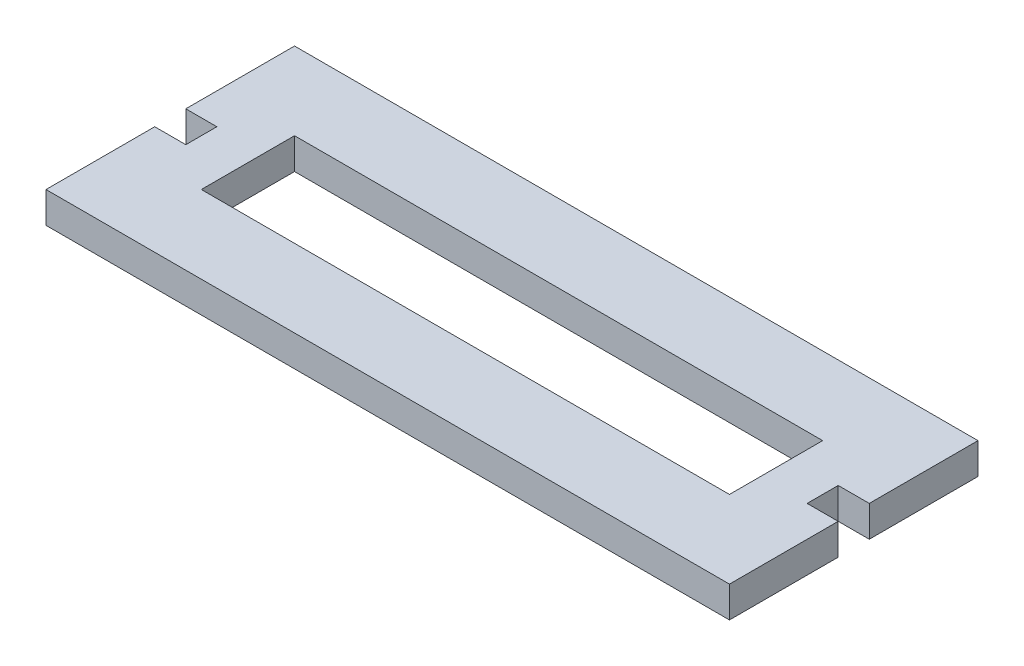
ISO-10303-21;
HEADER;
FILE_DESCRIPTION(('STEP AP214'),'2;1');
FILE_NAME('part.step','',(''),(''),'','','');
FILE_SCHEMA(('AUTOMOTIVE_DESIGN { 1 0 10303 214 1 1 1 1 }'));
ENDSEC;
DATA;
#1=APPLICATION_CONTEXT('core data for automotive mechanical design processes');
#2=APPLICATION_PROTOCOL_DEFINITION('international standard','automotive_design',2000,#1);
#3=PRODUCT_CONTEXT('',#1,'mechanical');
#4=PRODUCT('Part','Part','',(#3));
#5=PRODUCT_RELATED_PRODUCT_CATEGORY('part','',(#4));
#6=PRODUCT_DEFINITION_FORMATION('','',#4);
#7=PRODUCT_DEFINITION_CONTEXT('part definition',#1,'design');
#8=PRODUCT_DEFINITION('design','',#6,#7);
#9=PRODUCT_DEFINITION_SHAPE('','',#8);
#10=(LENGTH_UNIT() NAMED_UNIT(*) SI_UNIT(.MILLI.,.METRE.));
#11=(NAMED_UNIT(*) PLANE_ANGLE_UNIT() SI_UNIT($,.RADIAN.));
#12=(NAMED_UNIT(*) SI_UNIT($,.STERADIAN.) SOLID_ANGLE_UNIT());
#13=UNCERTAINTY_MEASURE_WITH_UNIT(LENGTH_MEASURE(1.E-05),#10,'distance_accuracy_value','');
#14=(GEOMETRIC_REPRESENTATION_CONTEXT(3) GLOBAL_UNCERTAINTY_ASSIGNED_CONTEXT((#13)) GLOBAL_UNIT_ASSIGNED_CONTEXT((#10,
#11,#12)) REPRESENTATION_CONTEXT('',''));
#15=CARTESIAN_POINT('',(0.,0.,0.));
#16=DIRECTION('',(0.,0.,1.));
#17=DIRECTION('',(1.,0.,0.));
#18=AXIS2_PLACEMENT_3D('',#15,#16,#17);
#19=CARTESIAN_POINT('',(0.,3.175,0.));
#20=DIRECTION('',(0.,0.,-1.));
#21=DIRECTION('',(-1.,0.,0.));
#22=AXIS2_PLACEMENT_3D('',#19,#20,#21);
#23=PLANE('',#22);
#24=DIRECTION('',(1.,0.,0.));
#25=VECTOR('',#24,1.);
#26=CARTESIAN_POINT('',(0.,0.,0.));
#27=LINE('',#26,#25);
#28=CARTESIAN_POINT('',(-3.175,0.,0.));
#29=VERTEX_POINT('',#28);
#30=CARTESIAN_POINT('',(66.675,0.,0.));
#31=VERTEX_POINT('',#30);
#32=EDGE_CURVE('E182',#29,#31,#27,.T.);
#33=ORIENTED_EDGE('',*,*,#32,.T.);
#34=DIRECTION('',(0.,-1.,0.));
#35=VECTOR('',#34,1.);
#36=CARTESIAN_POINT('',(66.675,3.175,0.));
#37=LINE('',#36,#35);
#38=CARTESIAN_POINT('',(66.675,3.175,0.));
#39=VERTEX_POINT('',#38);
#40=EDGE_CURVE('E11',#39,#31,#37,.T.);
#41=ORIENTED_EDGE('',*,*,#40,.F.);
#42=DIRECTION('',(1.,0.,0.));
#43=VECTOR('',#42,1.);
#44=CARTESIAN_POINT('',(0.,3.175,0.));
#45=LINE('',#44,#43);
#46=CARTESIAN_POINT('',(-3.175,3.175,0.));
#47=VERTEX_POINT('',#46);
#48=EDGE_CURVE('E186',#47,#39,#45,.T.);
#49=ORIENTED_EDGE('',*,*,#48,.F.);
#50=DIRECTION('',(0.,-1.,0.));
#51=VECTOR('',#50,1.);
#52=CARTESIAN_POINT('',(-3.175,3.175,0.));
#53=LINE('',#52,#51);
#54=EDGE_CURVE('E218',#47,#29,#53,.T.);
#55=ORIENTED_EDGE('',*,*,#54,.T.);
#56=EDGE_LOOP('',(#33,#41,#49,#55));
#57=FACE_BOUND('',#56,.T.);
#58=ADVANCED_FACE('F37',(#57),#23,.F.);
#59=CARTESIAN_POINT('',(66.675,3.175,0.));
#60=DIRECTION('',(-1.,0.,0.));
#61=DIRECTION('',(0.,0.,1.));
#62=AXIS2_PLACEMENT_3D('',#59,#60,#61);
#63=PLANE('',#62);
#64=DIRECTION('',(0.,0.,-1.));
#65=VECTOR('',#64,1.);
#66=CARTESIAN_POINT('',(66.675,0.,0.));
#67=LINE('',#66,#65);
#68=CARTESIAN_POINT('',(66.675,0.,-11.1125));
#69=VERTEX_POINT('',#68);
#70=EDGE_CURVE('E221',#31,#69,#67,.T.);
#71=ORIENTED_EDGE('',*,*,#70,.T.);
#72=DIRECTION('',(0.,-1.,0.));
#73=VECTOR('',#72,1.);
#74=CARTESIAN_POINT('',(66.675,3.175,-11.1125));
#75=LINE('',#74,#73);
#76=CARTESIAN_POINT('',(66.675,3.175,-11.1125));
#77=VERTEX_POINT('',#76);
#78=EDGE_CURVE('E44',#77,#69,#75,.T.);
#79=ORIENTED_EDGE('',*,*,#78,.F.);
#80=DIRECTION('',(0.,0.,-1.));
#81=VECTOR('',#80,1.);
#82=CARTESIAN_POINT('',(66.675,3.175,0.));
#83=LINE('',#82,#81);
#84=EDGE_CURVE('E189',#39,#77,#83,.T.);
#85=ORIENTED_EDGE('',*,*,#84,.F.);
#86=ORIENTED_EDGE('',*,*,#40,.T.);
#87=EDGE_LOOP('',(#71,#79,#85,#86));
#88=FACE_BOUND('',#87,.T.);
#89=ADVANCED_FACE('F277',(#88),#63,.F.);
#90=CARTESIAN_POINT('',(0.,3.175,-11.1125));
#91=DIRECTION('',(0.,0.,-1.));
#92=DIRECTION('',(-1.,0.,0.));
#93=AXIS2_PLACEMENT_3D('',#90,#91,#92);
#94=PLANE('',#93);
#95=DIRECTION('',(1.,0.,0.));
#96=VECTOR('',#95,1.);
#97=CARTESIAN_POINT('',(0.,0.,-11.1125));
#98=LINE('',#97,#96);
#99=CARTESIAN_POINT('',(63.5,0.,-11.1125));
#100=VERTEX_POINT('',#99);
#101=EDGE_CURVE('E224',#100,#69,#98,.T.);
#102=ORIENTED_EDGE('',*,*,#101,.F.);
#103=DIRECTION('',(0.,-1.,0.));
#104=VECTOR('',#103,1.);
#105=CARTESIAN_POINT('',(63.5,3.175,-11.1125));
#106=LINE('',#105,#104);
#107=CARTESIAN_POINT('',(63.5,3.175,-11.1125));
#108=VERTEX_POINT('',#107);
#109=EDGE_CURVE('E270',#108,#100,#106,.T.);
#110=ORIENTED_EDGE('',*,*,#109,.F.);
#111=DIRECTION('',(1.,0.,0.));
#112=VECTOR('',#111,1.);
#113=CARTESIAN_POINT('',(0.,3.175,-11.1125));
#114=LINE('',#113,#112);
#115=EDGE_CURVE('E192',#108,#77,#114,.T.);
#116=ORIENTED_EDGE('',*,*,#115,.T.);
#117=ORIENTED_EDGE('',*,*,#78,.T.);
#118=EDGE_LOOP('',(#102,#110,#116,#117));
#119=FACE_BOUND('',#118,.T.);
#120=ADVANCED_FACE('F274',(#119),#94,.T.);
#121=CARTESIAN_POINT('',(63.5,3.175,0.));
#122=DIRECTION('',(-1.,0.,0.));
#123=DIRECTION('',(0.,0.,1.));
#124=AXIS2_PLACEMENT_3D('',#121,#122,#123);
#125=PLANE('',#124);
#126=DIRECTION('',(0.,0.,-1.));
#127=VECTOR('',#126,1.);
#128=CARTESIAN_POINT('',(63.5,0.,0.));
#129=LINE('',#128,#127);
#130=CARTESIAN_POINT('',(63.5,0.,-14.2875));
#131=VERTEX_POINT('',#130);
#132=EDGE_CURVE('E227',#100,#131,#129,.T.);
#133=ORIENTED_EDGE('',*,*,#132,.T.);
#134=DIRECTION('',(0.,-1.,0.));
#135=VECTOR('',#134,1.);
#136=CARTESIAN_POINT('',(63.5,3.175,-14.2875));
#137=LINE('',#136,#135);
#138=CARTESIAN_POINT('',(63.5,3.175,-14.2875));
#139=VERTEX_POINT('',#138);
#140=EDGE_CURVE('E267',#139,#131,#137,.T.);
#141=ORIENTED_EDGE('',*,*,#140,.F.);
#142=DIRECTION('',(0.,0.,-1.));
#143=VECTOR('',#142,1.);
#144=CARTESIAN_POINT('',(63.5,3.175,0.));
#145=LINE('',#144,#143);
#146=EDGE_CURVE('E195',#108,#139,#145,.T.);
#147=ORIENTED_EDGE('',*,*,#146,.F.);
#148=ORIENTED_EDGE('',*,*,#109,.T.);
#149=EDGE_LOOP('',(#133,#141,#147,#148));
#150=FACE_BOUND('',#149,.T.);
#151=ADVANCED_FACE('F285',(#150),#125,.F.);
#152=CARTESIAN_POINT('',(0.,3.175,-14.2875));
#153=DIRECTION('',(0.,0.,-1.));
#154=DIRECTION('',(-1.,0.,0.));
#155=AXIS2_PLACEMENT_3D('',#152,#153,#154);
#156=PLANE('',#155);
#157=DIRECTION('',(1.,0.,0.));
#158=VECTOR('',#157,1.);
#159=CARTESIAN_POINT('',(0.,0.,-14.2875));
#160=LINE('',#159,#158);
#161=CARTESIAN_POINT('',(66.675,0.,-14.2875));
#162=VERTEX_POINT('',#161);
#163=EDGE_CURVE('E229',#131,#162,#160,.T.);
#164=ORIENTED_EDGE('',*,*,#163,.T.);
#165=DIRECTION('',(0.,-1.,0.));
#166=VECTOR('',#165,1.);
#167=CARTESIAN_POINT('',(66.675,3.175,-14.2875));
#168=LINE('',#167,#166);
#169=CARTESIAN_POINT('',(66.675,3.175,-14.2875));
#170=VERTEX_POINT('',#169);
#171=EDGE_CURVE('E264',#170,#162,#168,.T.);
#172=ORIENTED_EDGE('',*,*,#171,.F.);
#173=DIRECTION('',(1.,0.,0.));
#174=VECTOR('',#173,1.);
#175=CARTESIAN_POINT('',(0.,3.175,-14.2875));
#176=LINE('',#175,#174);
#177=EDGE_CURVE('E197',#139,#170,#176,.T.);
#178=ORIENTED_EDGE('',*,*,#177,.F.);
#179=ORIENTED_EDGE('',*,*,#140,.T.);
#180=EDGE_LOOP('',(#164,#172,#178,#179));
#181=FACE_BOUND('',#180,.T.);
#182=ADVANCED_FACE('F289',(#181),#156,.F.);
#183=CARTESIAN_POINT('',(66.675,3.175,0.));
#184=DIRECTION('',(-1.,0.,0.));
#185=DIRECTION('',(0.,0.,1.));
#186=AXIS2_PLACEMENT_3D('',#183,#184,#185);
#187=PLANE('',#186);
#188=DIRECTION('',(0.,0.,-1.));
#189=VECTOR('',#188,1.);
#190=CARTESIAN_POINT('',(66.675,0.,0.));
#191=LINE('',#190,#189);
#192=CARTESIAN_POINT('',(66.675,0.,-25.4));
#193=VERTEX_POINT('',#192);
#194=EDGE_CURVE('E231',#162,#193,#191,.T.);
#195=ORIENTED_EDGE('',*,*,#194,.T.);
#196=DIRECTION('',(0.,-1.,0.));
#197=VECTOR('',#196,1.);
#198=CARTESIAN_POINT('',(66.675,3.175,-25.4));
#199=LINE('',#198,#197);
#200=CARTESIAN_POINT('',(66.675,3.175,-25.4));
#201=VERTEX_POINT('',#200);
#202=EDGE_CURVE('E262',#201,#193,#199,.T.);
#203=ORIENTED_EDGE('',*,*,#202,.F.);
#204=DIRECTION('',(0.,0.,-1.));
#205=VECTOR('',#204,1.);
#206=CARTESIAN_POINT('',(66.675,3.175,0.));
#207=LINE('',#206,#205);
#208=EDGE_CURVE('E199',#170,#201,#207,.T.);
#209=ORIENTED_EDGE('',*,*,#208,.F.);
#210=ORIENTED_EDGE('',*,*,#171,.T.);
#211=EDGE_LOOP('',(#195,#203,#209,#210));
#212=FACE_BOUND('',#211,.T.);
#213=ADVANCED_FACE('F323',(#212),#187,.F.);
#214=CARTESIAN_POINT('',(0.,3.175,-25.4));
#215=DIRECTION('',(0.,0.,-1.));
#216=DIRECTION('',(-1.,0.,0.));
#217=AXIS2_PLACEMENT_3D('',#214,#215,#216);
#218=PLANE('',#217);
#219=DIRECTION('',(1.,0.,0.));
#220=VECTOR('',#219,1.);
#221=CARTESIAN_POINT('',(0.,0.,-25.4));
#222=LINE('',#221,#220);
#223=CARTESIAN_POINT('',(-3.175,0.,-25.4));
#224=VERTEX_POINT('',#223);
#225=EDGE_CURVE('E234',#224,#193,#222,.T.);
#226=ORIENTED_EDGE('',*,*,#225,.F.);
#227=DIRECTION('',(0.,-1.,0.));
#228=VECTOR('',#227,1.);
#229=CARTESIAN_POINT('',(-3.175,3.175,-25.4));
#230=LINE('',#229,#228);
#231=CARTESIAN_POINT('',(-3.175,3.175,-25.4));
#232=VERTEX_POINT('',#231);
#233=EDGE_CURVE('E260',#232,#224,#230,.T.);
#234=ORIENTED_EDGE('',*,*,#233,.F.);
#235=DIRECTION('',(1.,0.,0.));
#236=VECTOR('',#235,1.);
#237=CARTESIAN_POINT('',(0.,3.175,-25.4));
#238=LINE('',#237,#236);
#239=EDGE_CURVE('E201',#232,#201,#238,.T.);
#240=ORIENTED_EDGE('',*,*,#239,.T.);
#241=ORIENTED_EDGE('',*,*,#202,.T.);
#242=EDGE_LOOP('',(#226,#234,#240,#241));
#243=FACE_BOUND('',#242,.T.);
#244=ADVANCED_FACE('F321',(#243),#218,.T.);
#245=CARTESIAN_POINT('',(-3.175,3.175,0.));
#246=DIRECTION('',(-1.,0.,0.));
#247=DIRECTION('',(0.,0.,1.));
#248=AXIS2_PLACEMENT_3D('',#245,#246,#247);
#249=PLANE('',#248);
#250=DIRECTION('',(0.,0.,-1.));
#251=VECTOR('',#250,1.);
#252=CARTESIAN_POINT('',(-3.175,0.,0.));
#253=LINE('',#252,#251);
#254=CARTESIAN_POINT('',(-3.175,0.,-14.2875));
#255=VERTEX_POINT('',#254);
#256=EDGE_CURVE('E237',#255,#224,#253,.T.);
#257=ORIENTED_EDGE('',*,*,#256,.F.);
#258=DIRECTION('',(0.,-1.,0.));
#259=VECTOR('',#258,1.);
#260=CARTESIAN_POINT('',(-3.175,3.175,-14.2875));
#261=LINE('',#260,#259);
#262=CARTESIAN_POINT('',(-3.175,3.175,-14.2875));
#263=VERTEX_POINT('',#262);
#264=EDGE_CURVE('E258',#263,#255,#261,.T.);
#265=ORIENTED_EDGE('',*,*,#264,.F.);
#266=DIRECTION('',(0.,0.,-1.));
#267=VECTOR('',#266,1.);
#268=CARTESIAN_POINT('',(-3.175,3.175,0.));
#269=LINE('',#268,#267);
#270=EDGE_CURVE('E204',#263,#232,#269,.T.);
#271=ORIENTED_EDGE('',*,*,#270,.T.);
#272=ORIENTED_EDGE('',*,*,#233,.T.);
#273=EDGE_LOOP('',(#257,#265,#271,#272));
#274=FACE_BOUND('',#273,.T.);
#275=ADVANCED_FACE('F318',(#274),#249,.T.);
#276=CARTESIAN_POINT('',(0.,3.175,-14.2875));
#277=DIRECTION('',(0.,0.,-1.));
#278=DIRECTION('',(-1.,0.,0.));
#279=AXIS2_PLACEMENT_3D('',#276,#277,#278);
#280=PLANE('',#279);
#281=DIRECTION('',(1.,0.,0.));
#282=VECTOR('',#281,1.);
#283=CARTESIAN_POINT('',(0.,0.,-14.2875));
#284=LINE('',#283,#282);
#285=CARTESIAN_POINT('',(0.,0.,-14.2875));
#286=VERTEX_POINT('',#285);
#287=EDGE_CURVE('E240',#255,#286,#284,.T.);
#288=ORIENTED_EDGE('',*,*,#287,.T.);
#289=DIRECTION('',(0.,-1.,0.));
#290=VECTOR('',#289,1.);
#291=CARTESIAN_POINT('',(0.,3.175,-14.2875));
#292=LINE('',#291,#290);
#293=CARTESIAN_POINT('',(0.,3.175,-14.2875));
#294=VERTEX_POINT('',#293);
#295=EDGE_CURVE('E256',#294,#286,#292,.T.);
#296=ORIENTED_EDGE('',*,*,#295,.F.);
#297=DIRECTION('',(1.,0.,0.));
#298=VECTOR('',#297,1.);
#299=CARTESIAN_POINT('',(0.,3.175,-14.2875));
#300=LINE('',#299,#298);
#301=EDGE_CURVE('E207',#263,#294,#300,.T.);
#302=ORIENTED_EDGE('',*,*,#301,.F.);
#303=ORIENTED_EDGE('',*,*,#264,.T.);
#304=EDGE_LOOP('',(#288,#296,#302,#303));
#305=FACE_BOUND('',#304,.T.);
#306=ADVANCED_FACE('F315',(#305),#280,.F.);
#307=CARTESIAN_POINT('',(0.,3.175,0.));
#308=DIRECTION('',(-1.,0.,0.));
#309=DIRECTION('',(0.,0.,1.));
#310=AXIS2_PLACEMENT_3D('',#307,#308,#309);
#311=PLANE('',#310);
#312=DIRECTION('',(0.,0.,-1.));
#313=VECTOR('',#312,1.);
#314=CARTESIAN_POINT('',(0.,0.,0.));
#315=LINE('',#314,#313);
#316=CARTESIAN_POINT('',(0.,0.,-11.1125));
#317=VERTEX_POINT('',#316);
#318=EDGE_CURVE('E243',#317,#286,#315,.T.);
#319=ORIENTED_EDGE('',*,*,#318,.F.);
#320=DIRECTION('',(0.,-1.,0.));
#321=VECTOR('',#320,1.);
#322=CARTESIAN_POINT('',(0.,3.175,-11.1125));
#323=LINE('',#322,#321);
#324=CARTESIAN_POINT('',(0.,3.175,-11.1125));
#325=VERTEX_POINT('',#324);
#326=EDGE_CURVE('E254',#325,#317,#323,.T.);
#327=ORIENTED_EDGE('',*,*,#326,.F.);
#328=DIRECTION('',(0.,0.,-1.));
#329=VECTOR('',#328,1.);
#330=CARTESIAN_POINT('',(0.,3.175,0.));
#331=LINE('',#330,#329);
#332=EDGE_CURVE('E209',#325,#294,#331,.T.);
#333=ORIENTED_EDGE('',*,*,#332,.T.);
#334=ORIENTED_EDGE('',*,*,#295,.T.);
#335=EDGE_LOOP('',(#319,#327,#333,#334));
#336=FACE_BOUND('',#335,.T.);
#337=ADVANCED_FACE('F310',(#336),#311,.T.);
#338=CARTESIAN_POINT('',(0.,3.175,-11.1125));
#339=DIRECTION('',(0.,0.,-1.));
#340=DIRECTION('',(-1.,0.,0.));
#341=AXIS2_PLACEMENT_3D('',#338,#339,#340);
#342=PLANE('',#341);
#343=DIRECTION('',(1.,0.,0.));
#344=VECTOR('',#343,1.);
#345=CARTESIAN_POINT('',(0.,0.,-11.1125));
#346=LINE('',#345,#344);
#347=CARTESIAN_POINT('',(-3.175,0.,-11.1125));
#348=VERTEX_POINT('',#347);
#349=EDGE_CURVE('E246',#348,#317,#346,.T.);
#350=ORIENTED_EDGE('',*,*,#349,.F.);
#351=DIRECTION('',(0.,-1.,0.));
#352=VECTOR('',#351,1.);
#353=CARTESIAN_POINT('',(-3.175,3.175,-11.1125));
#354=LINE('',#353,#352);
#355=CARTESIAN_POINT('',(-3.175,3.175,-11.1125));
#356=VERTEX_POINT('',#355);
#357=EDGE_CURVE('E252',#356,#348,#354,.T.);
#358=ORIENTED_EDGE('',*,*,#357,.F.);
#359=DIRECTION('',(1.,0.,0.));
#360=VECTOR('',#359,1.);
#361=CARTESIAN_POINT('',(0.,3.175,-11.1125));
#362=LINE('',#361,#360);
#363=EDGE_CURVE('E212',#356,#325,#362,.T.);
#364=ORIENTED_EDGE('',*,*,#363,.T.);
#365=ORIENTED_EDGE('',*,*,#326,.T.);
#366=EDGE_LOOP('',(#350,#358,#364,#365));
#367=FACE_BOUND('',#366,.T.);
#368=ADVANCED_FACE('F305',(#367),#342,.T.);
#369=CARTESIAN_POINT('',(-3.175,3.175,0.));
#370=DIRECTION('',(-1.,0.,0.));
#371=DIRECTION('',(0.,0.,1.));
#372=AXIS2_PLACEMENT_3D('',#369,#370,#371);
#373=PLANE('',#372);
#374=DIRECTION('',(0.,0.,-1.));
#375=VECTOR('',#374,1.);
#376=CARTESIAN_POINT('',(-3.175,0.,0.));
#377=LINE('',#376,#375);
#378=EDGE_CURVE('E190',#29,#348,#377,.T.);
#379=ORIENTED_EDGE('',*,*,#378,.F.);
#380=ORIENTED_EDGE('',*,*,#54,.F.);
#381=DIRECTION('',(0.,0.,-1.));
#382=VECTOR('',#381,1.);
#383=CARTESIAN_POINT('',(-3.175,3.175,0.));
#384=LINE('',#383,#382);
#385=EDGE_CURVE('E215',#47,#356,#384,.T.);
#386=ORIENTED_EDGE('',*,*,#385,.T.);
#387=ORIENTED_EDGE('',*,*,#357,.T.);
#388=EDGE_LOOP('',(#379,#380,#386,#387));
#389=FACE_BOUND('',#388,.T.);
#390=ADVANCED_FACE('F302',(#389),#373,.T.);
#391=CARTESIAN_POINT('',(0.,3.175,0.));
#392=DIRECTION('',(0.,1.,0.));
#393=DIRECTION('',(0.,0.,1.));
#394=AXIS2_PLACEMENT_3D('',#391,#392,#393);
#395=PLANE('',#394);
#396=DIRECTION('',(0.,0.,1.));
#397=VECTOR('',#396,1.);
#398=CARTESIAN_POINT('',(4.7625,3.175,-7.9375));
#399=LINE('',#398,#397);
#400=CARTESIAN_POINT('',(4.7625,3.175,-17.4625));
#401=VERTEX_POINT('',#400);
#402=CARTESIAN_POINT('',(4.7625,3.175,-7.9375));
#403=VERTEX_POINT('',#402);
#404=EDGE_CURVE('E51',#401,#403,#399,.T.);
#405=ORIENTED_EDGE('',*,*,#404,.F.);
#406=DIRECTION('',(-1.,0.,0.));
#407=VECTOR('',#406,1.);
#408=CARTESIAN_POINT('',(4.7625,3.175,-17.4625));
#409=LINE('',#408,#407);
#410=CARTESIAN_POINT('',(58.7375,3.175,-17.4625));
#411=VERTEX_POINT('',#410);
#412=EDGE_CURVE('E167',#411,#401,#409,.T.);
#413=ORIENTED_EDGE('',*,*,#412,.F.);
#414=DIRECTION('',(0.,0.,-1.));
#415=VECTOR('',#414,1.);
#416=CARTESIAN_POINT('',(58.7375,3.175,-7.9375));
#417=LINE('',#416,#415);
#418=CARTESIAN_POINT('',(58.7375,3.175,-7.9375));
#419=VERTEX_POINT('',#418);
#420=EDGE_CURVE('E170',#419,#411,#417,.T.);
#421=ORIENTED_EDGE('',*,*,#420,.F.);
#422=DIRECTION('',(1.,0.,0.));
#423=VECTOR('',#422,1.);
#424=CARTESIAN_POINT('',(4.7625,3.175,-7.9375));
#425=LINE('',#424,#423);
#426=EDGE_CURVE('E176',#403,#419,#425,.T.);
#427=ORIENTED_EDGE('',*,*,#426,.F.);
#428=EDGE_LOOP('',(#405,#413,#421,#427));
#429=FACE_BOUND('',#428,.T.);
#430=ORIENTED_EDGE('',*,*,#48,.T.);
#431=ORIENTED_EDGE('',*,*,#84,.T.);
#432=ORIENTED_EDGE('',*,*,#115,.F.);
#433=ORIENTED_EDGE('',*,*,#146,.T.);
#434=ORIENTED_EDGE('',*,*,#177,.T.);
#435=ORIENTED_EDGE('',*,*,#208,.T.);
#436=ORIENTED_EDGE('',*,*,#239,.F.);
#437=ORIENTED_EDGE('',*,*,#270,.F.);
#438=ORIENTED_EDGE('',*,*,#301,.T.);
#439=ORIENTED_EDGE('',*,*,#332,.F.);
#440=ORIENTED_EDGE('',*,*,#363,.F.);
#441=ORIENTED_EDGE('',*,*,#385,.F.);
#442=EDGE_LOOP('',(#430,#431,#432,#433,#434,#435,#436,#437,#438,#439,#440,#441));
#443=FACE_BOUND('',#442,.T.);
#444=ADVANCED_FACE('F293',(#429,#443),#395,.T.);
#445=CARTESIAN_POINT('',(0.,0.,0.));
#446=DIRECTION('',(0.,1.,0.));
#447=DIRECTION('',(0.,0.,1.));
#448=AXIS2_PLACEMENT_3D('',#445,#446,#447);
#449=PLANE('',#448);
#450=DIRECTION('',(-1.,0.,0.));
#451=VECTOR('',#450,1.);
#452=CARTESIAN_POINT('',(4.7625,0.,-17.4625));
#453=LINE('',#452,#451);
#454=CARTESIAN_POINT('',(58.7375,0.,-17.4625));
#455=VERTEX_POINT('',#454);
#456=CARTESIAN_POINT('',(4.7625,0.,-17.4625));
#457=VERTEX_POINT('',#456);
#458=EDGE_CURVE('E157',#455,#457,#453,.T.);
#459=ORIENTED_EDGE('',*,*,#458,.T.);
#460=DIRECTION('',(0.,0.,1.));
#461=VECTOR('',#460,1.);
#462=CARTESIAN_POINT('',(4.7625,0.,-7.9375));
#463=LINE('',#462,#461);
#464=CARTESIAN_POINT('',(4.7625,0.,-7.9375));
#465=VERTEX_POINT('',#464);
#466=EDGE_CURVE('E151',#457,#465,#463,.T.);
#467=ORIENTED_EDGE('',*,*,#466,.T.);
#468=DIRECTION('',(1.,0.,0.));
#469=VECTOR('',#468,1.);
#470=CARTESIAN_POINT('',(4.7625,0.,-7.9375));
#471=LINE('',#470,#469);
#472=CARTESIAN_POINT('',(58.7375,0.,-7.9375));
#473=VERTEX_POINT('',#472);
#474=EDGE_CURVE('E160',#465,#473,#471,.T.);
#475=ORIENTED_EDGE('',*,*,#474,.T.);
#476=DIRECTION('',(0.,0.,-1.));
#477=VECTOR('',#476,1.);
#478=CARTESIAN_POINT('',(58.7375,0.,-7.9375));
#479=LINE('',#478,#477);
#480=EDGE_CURVE('E59',#473,#455,#479,.T.);
#481=ORIENTED_EDGE('',*,*,#480,.T.);
#482=EDGE_LOOP('',(#459,#467,#475,#481));
#483=FACE_BOUND('',#482,.T.);
#484=ORIENTED_EDGE('',*,*,#32,.F.);
#485=ORIENTED_EDGE('',*,*,#378,.T.);
#486=ORIENTED_EDGE('',*,*,#349,.T.);
#487=ORIENTED_EDGE('',*,*,#318,.T.);
#488=ORIENTED_EDGE('',*,*,#287,.F.);
#489=ORIENTED_EDGE('',*,*,#256,.T.);
#490=ORIENTED_EDGE('',*,*,#225,.T.);
#491=ORIENTED_EDGE('',*,*,#194,.F.);
#492=ORIENTED_EDGE('',*,*,#163,.F.);
#493=ORIENTED_EDGE('',*,*,#132,.F.);
#494=ORIENTED_EDGE('',*,*,#101,.T.);
#495=ORIENTED_EDGE('',*,*,#70,.F.);
#496=EDGE_LOOP('',(#484,#485,#486,#487,#488,#489,#490,#491,#492,#493,#494,#495));
#497=FACE_BOUND('',#496,.T.);
#498=ADVANCED_FACE('F164',(#483,#497),#449,.F.);
#499=CARTESIAN_POINT('',(4.7625,0.,-7.9375));
#500=DIRECTION('',(-1.,0.,0.));
#501=DIRECTION('',(0.,0.,1.));
#502=AXIS2_PLACEMENT_3D('',#499,#500,#501);
#503=PLANE('',#502);
#504=ORIENTED_EDGE('',*,*,#404,.T.);
#505=DIRECTION('',(0.,1.,0.));
#506=VECTOR('',#505,1.);
#507=CARTESIAN_POINT('',(4.7625,0.,-7.9375));
#508=LINE('',#507,#506);
#509=EDGE_CURVE('E147',#465,#403,#508,.T.);
#510=ORIENTED_EDGE('',*,*,#509,.F.);
#511=ORIENTED_EDGE('',*,*,#466,.F.);
#512=DIRECTION('',(0.,1.,0.));
#513=VECTOR('',#512,1.);
#514=CARTESIAN_POINT('',(4.7625,0.,-17.4625));
#515=LINE('',#514,#513);
#516=EDGE_CURVE('E180',#457,#401,#515,.T.);
#517=ORIENTED_EDGE('',*,*,#516,.T.);
#518=EDGE_LOOP('',(#504,#510,#511,#517));
#519=FACE_BOUND('',#518,.T.);
#520=ADVANCED_FACE('F149',(#519),#503,.F.);
#521=CARTESIAN_POINT('',(4.7625,0.,-17.4625));
#522=DIRECTION('',(0.,0.,-1.));
#523=DIRECTION('',(-1.,0.,0.));
#524=AXIS2_PLACEMENT_3D('',#521,#522,#523);
#525=PLANE('',#524);
#526=ORIENTED_EDGE('',*,*,#412,.T.);
#527=ORIENTED_EDGE('',*,*,#516,.F.);
#528=ORIENTED_EDGE('',*,*,#458,.F.);
#529=DIRECTION('',(0.,1.,0.));
#530=VECTOR('',#529,1.);
#531=CARTESIAN_POINT('',(58.7375,0.,-17.4625));
#532=LINE('',#531,#530);
#533=EDGE_CURVE('E183',#455,#411,#532,.T.);
#534=ORIENTED_EDGE('',*,*,#533,.T.);
#535=EDGE_LOOP('',(#526,#527,#528,#534));
#536=FACE_BOUND('',#535,.T.);
#537=ADVANCED_FACE('F434',(#536),#525,.F.);
#538=CARTESIAN_POINT('',(58.7375,0.,-7.9375));
#539=DIRECTION('',(1.,0.,0.));
#540=DIRECTION('',(0.,0.,-1.));
#541=AXIS2_PLACEMENT_3D('',#538,#539,#540);
#542=PLANE('',#541);
#543=ORIENTED_EDGE('',*,*,#420,.T.);
#544=ORIENTED_EDGE('',*,*,#533,.F.);
#545=ORIENTED_EDGE('',*,*,#480,.F.);
#546=DIRECTION('',(0.,1.,0.));
#547=VECTOR('',#546,1.);
#548=CARTESIAN_POINT('',(58.7375,0.,-7.9375));
#549=LINE('',#548,#547);
#550=EDGE_CURVE('E156',#473,#419,#549,.T.);
#551=ORIENTED_EDGE('',*,*,#550,.T.);
#552=EDGE_LOOP('',(#543,#544,#545,#551));
#553=FACE_BOUND('',#552,.T.);
#554=ADVANCED_FACE('F443',(#553),#542,.F.);
#555=CARTESIAN_POINT('',(4.7625,0.,-7.9375));
#556=DIRECTION('',(0.,0.,1.));
#557=DIRECTION('',(1.,0.,0.));
#558=AXIS2_PLACEMENT_3D('',#555,#556,#557);
#559=PLANE('',#558);
#560=ORIENTED_EDGE('',*,*,#426,.T.);
#561=ORIENTED_EDGE('',*,*,#550,.F.);
#562=ORIENTED_EDGE('',*,*,#474,.F.);
#563=ORIENTED_EDGE('',*,*,#509,.T.);
#564=EDGE_LOOP('',(#560,#561,#562,#563));
#565=FACE_BOUND('',#564,.T.);
#566=ADVANCED_FACE('F161',(#565),#559,.F.);
#567=CLOSED_SHELL('',(#58,#89,#120,#151,#182,#213,#244,#275,#306,#337,#368,#390,#444,#498,#520,
#537,#554,#566));
#568=MANIFOLD_SOLID_BREP('B2',#567);
#569=ADVANCED_BREP_SHAPE_REPRESENTATION('',(#18,#568),#14);
#570=SHAPE_DEFINITION_REPRESENTATION(#9,#569);
ENDSEC;
END-ISO-10303-21;
